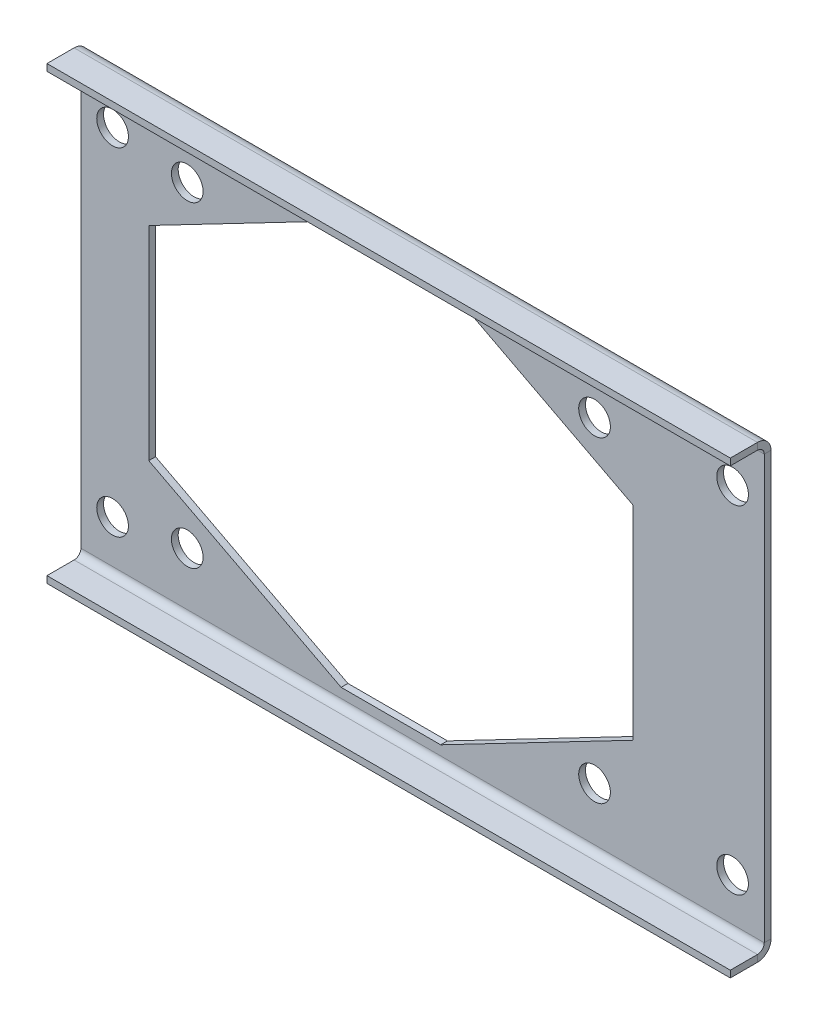
ISO-10303-21;
HEADER;
FILE_DESCRIPTION(('STEP AP214'),'2;1');
FILE_NAME('part.step','',(''),(''),'','','');
FILE_SCHEMA(('AUTOMOTIVE_DESIGN { 1 0 10303 214 1 1 1 1 }'));
ENDSEC;
DATA;
#1=APPLICATION_CONTEXT('core data for automotive mechanical design processes');
#2=APPLICATION_PROTOCOL_DEFINITION('international standard','automotive_design',2000,#1);
#3=PRODUCT_CONTEXT('',#1,'mechanical');
#4=PRODUCT('Part','Part','',(#3));
#5=PRODUCT_RELATED_PRODUCT_CATEGORY('part','',(#4));
#6=PRODUCT_DEFINITION_FORMATION('','',#4);
#7=PRODUCT_DEFINITION_CONTEXT('part definition',#1,'design');
#8=PRODUCT_DEFINITION('design','',#6,#7);
#9=PRODUCT_DEFINITION_SHAPE('','',#8);
#10=(LENGTH_UNIT() NAMED_UNIT(*) SI_UNIT(.MILLI.,.METRE.));
#11=(NAMED_UNIT(*) PLANE_ANGLE_UNIT() SI_UNIT($,.RADIAN.));
#12=(NAMED_UNIT(*) SI_UNIT($,.STERADIAN.) SOLID_ANGLE_UNIT());
#13=UNCERTAINTY_MEASURE_WITH_UNIT(LENGTH_MEASURE(1.E-05),#10,'distance_accuracy_value','');
#14=(GEOMETRIC_REPRESENTATION_CONTEXT(3) GLOBAL_UNCERTAINTY_ASSIGNED_CONTEXT((#13)) GLOBAL_UNIT_ASSIGNED_CONTEXT((#10,
#11,#12)) REPRESENTATION_CONTEXT('',''));
#15=CARTESIAN_POINT('',(0.,0.,0.));
#16=DIRECTION('',(0.,0.,1.));
#17=DIRECTION('',(1.,0.,0.));
#18=AXIS2_PLACEMENT_3D('',#15,#16,#17);
#19=CARTESIAN_POINT('',(151.,96.5,-3.));
#20=DIRECTION('',(1.,0.,0.));
#21=DIRECTION('',(0.,0.,-1.));
#22=AXIS2_PLACEMENT_3D('',#19,#20,#21);
#23=PLANE('',#22);
#24=DIRECTION('',(0.,1.,0.));
#25=VECTOR('',#24,1.);
#26=CARTESIAN_POINT('',(151.,96.5,0.));
#27=LINE('',#26,#25);
#28=CARTESIAN_POINT('',(151.,2.99999999999999,0.));
#29=VERTEX_POINT('',#28);
#30=CARTESIAN_POINT('',(151.,190.,0.));
#31=VERTEX_POINT('',#30);
#32=EDGE_CURVE('E345',#29,#31,#27,.T.);
#33=ORIENTED_EDGE('',*,*,#32,.F.);
#34=DIRECTION('',(0.,0.,-1.));
#35=VECTOR('',#34,1.);
#36=CARTESIAN_POINT('',(151.,2.99999999999999,0.));
#37=LINE('',#36,#35);
#38=CARTESIAN_POINT('',(151.,2.99999999999999,-3.));
#39=VERTEX_POINT('',#38);
#40=EDGE_CURVE('E310',#29,#39,#37,.T.);
#41=ORIENTED_EDGE('',*,*,#40,.T.);
#42=DIRECTION('',(0.,1.,0.));
#43=VECTOR('',#42,1.);
#44=CARTESIAN_POINT('',(151.,96.5,-3.));
#45=LINE('',#44,#43);
#46=CARTESIAN_POINT('',(151.,190.,-3.));
#47=VERTEX_POINT('',#46);
#48=EDGE_CURVE('E328',#39,#47,#45,.T.);
#49=ORIENTED_EDGE('',*,*,#48,.T.);
#50=DIRECTION('',(0.,0.,-1.));
#51=VECTOR('',#50,1.);
#52=CARTESIAN_POINT('',(151.,190.,0.));
#53=LINE('',#52,#51);
#54=EDGE_CURVE('E227',#31,#47,#53,.T.);
#55=ORIENTED_EDGE('',*,*,#54,.F.);
#56=EDGE_LOOP('',(#33,#41,#49,#55));
#57=FACE_BOUND('',#56,.T.);
#58=ADVANCED_FACE('F45',(#57),#23,.T.);
#59=CARTESIAN_POINT('',(0.,0.,-3.));
#60=DIRECTION('',(0.,0.,-1.));
#61=DIRECTION('',(-1.,0.,0.));
#62=AXIS2_PLACEMENT_3D('',#59,#60,#61);
#63=PLANE('',#62);
#64=CARTESIAN_POINT('',(76.,26.5,-3.));
#65=DIRECTION('',(0.,0.,1.));
#66=DIRECTION('',(1.,0.,0.));
#67=AXIS2_PLACEMENT_3D('',#64,#65,#66);
#68=CIRCLE('',#67,7.);
#69=CARTESIAN_POINT('',(83.,26.5,-3.));
#70=VERTEX_POINT('',#69);
#71=EDGE_CURVE('E818',#70,#70,#68,.T.);
#72=ORIENTED_EDGE('',*,*,#71,.T.);
#73=EDGE_LOOP('',(#72));
#74=FACE_BOUND('',#73,.T.);
#75=CARTESIAN_POINT('',(-104.,26.5,-3.));
#76=DIRECTION('',(0.,0.,1.));
#77=DIRECTION('',(1.,0.,0.));
#78=AXIS2_PLACEMENT_3D('',#75,#76,#77);
#79=CIRCLE('',#78,7.);
#80=CARTESIAN_POINT('',(-97.,26.5,-3.));
#81=VERTEX_POINT('',#80);
#82=EDGE_CURVE('E924',#81,#81,#79,.T.);
#83=ORIENTED_EDGE('',*,*,#82,.T.);
#84=EDGE_LOOP('',(#83));
#85=FACE_BOUND('',#84,.T.);
#86=CARTESIAN_POINT('',(-104.,166.5,-3.));
#87=DIRECTION('',(0.,0.,1.));
#88=DIRECTION('',(1.,0.,0.));
#89=AXIS2_PLACEMENT_3D('',#86,#87,#88);
#90=CIRCLE('',#89,7.);
#91=CARTESIAN_POINT('',(-97.,166.5,-3.));
#92=VERTEX_POINT('',#91);
#93=EDGE_CURVE('E834',#92,#92,#90,.T.);
#94=ORIENTED_EDGE('',*,*,#93,.T.);
#95=EDGE_LOOP('',(#94));
#96=FACE_BOUND('',#95,.T.);
#97=CARTESIAN_POINT('',(76.,166.5,-3.));
#98=DIRECTION('',(0.,0.,1.));
#99=DIRECTION('',(1.,0.,0.));
#100=AXIS2_PLACEMENT_3D('',#97,#98,#99);
#101=CIRCLE('',#100,7.);
#102=CARTESIAN_POINT('',(83.,166.5,-3.));
#103=VERTEX_POINT('',#102);
#104=EDGE_CURVE('E827',#103,#103,#101,.T.);
#105=ORIENTED_EDGE('',*,*,#104,.T.);
#106=EDGE_LOOP('',(#105));
#107=FACE_BOUND('',#106,.T.);
#108=CARTESIAN_POINT('',(137.,171.,-3.));
#109=DIRECTION('',(0.,0.,-1.));
#110=DIRECTION('',(1.,0.,0.));
#111=AXIS2_PLACEMENT_3D('',#108,#109,#110);
#112=CIRCLE('',#111,7.00000000000002);
#113=CARTESIAN_POINT('',(144.,171.,-3.));
#114=VERTEX_POINT('',#113);
#115=EDGE_CURVE('E830',#114,#114,#112,.T.);
#116=ORIENTED_EDGE('',*,*,#115,.F.);
#117=EDGE_LOOP('',(#116));
#118=FACE_BOUND('',#117,.T.);
#119=CARTESIAN_POINT('',(137.,22.,-3.));
#120=DIRECTION('',(0.,0.,-1.));
#121=DIRECTION('',(1.,0.,0.));
#122=AXIS2_PLACEMENT_3D('',#119,#120,#121);
#123=CIRCLE('',#122,7.00000000000001);
#124=CARTESIAN_POINT('',(144.,22.,-3.));
#125=VERTEX_POINT('',#124);
#126=EDGE_CURVE('E845',#125,#125,#123,.T.);
#127=ORIENTED_EDGE('',*,*,#126,.F.);
#128=EDGE_LOOP('',(#127));
#129=FACE_BOUND('',#128,.T.);
#130=CARTESIAN_POINT('',(-137.,22.,-3.));
#131=DIRECTION('',(0.,0.,-1.));
#132=DIRECTION('',(-1.,0.,0.));
#133=AXIS2_PLACEMENT_3D('',#130,#131,#132);
#134=CIRCLE('',#133,7.00000000000001);
#135=CARTESIAN_POINT('',(-144.,22.,-3.));
#136=VERTEX_POINT('',#135);
#137=EDGE_CURVE('E839',#136,#136,#134,.T.);
#138=ORIENTED_EDGE('',*,*,#137,.F.);
#139=EDGE_LOOP('',(#138));
#140=FACE_BOUND('',#139,.T.);
#141=CARTESIAN_POINT('',(-137.,171.,-3.));
#142=DIRECTION('',(0.,0.,-1.));
#143=DIRECTION('',(-1.,0.,0.));
#144=AXIS2_PLACEMENT_3D('',#141,#142,#143);
#145=CIRCLE('',#144,7.00000000000002);
#146=CARTESIAN_POINT('',(-144.,171.,-3.));
#147=VERTEX_POINT('',#146);
#148=EDGE_CURVE('E838',#147,#147,#145,.T.);
#149=ORIENTED_EDGE('',*,*,#148,.F.);
#150=EDGE_LOOP('',(#149));
#151=FACE_BOUND('',#150,.T.);
#152=DIRECTION('',(0.,-1.,0.));
#153=VECTOR('',#152,1.);
#154=CARTESIAN_POINT('',(-151.,0.,-3.));
#155=LINE('',#154,#153);
#156=CARTESIAN_POINT('',(-151.,190.,-3.));
#157=VERTEX_POINT('',#156);
#158=CARTESIAN_POINT('',(-151.,3.00000000000001,-3.));
#159=VERTEX_POINT('',#158);
#160=EDGE_CURVE('E325',#157,#159,#155,.T.);
#161=ORIENTED_EDGE('',*,*,#160,.F.);
#162=DIRECTION('',(1.,0.,0.));
#163=VECTOR('',#162,1.);
#164=CARTESIAN_POINT('',(151.,190.,-3.));
#165=LINE('',#164,#163);
#166=EDGE_CURVE('E228',#47,#157,#165,.F.);
#167=ORIENTED_EDGE('',*,*,#166,.F.);
#168=ORIENTED_EDGE('',*,*,#48,.F.);
#169=DIRECTION('',(1.,0.,0.));
#170=VECTOR('',#169,1.);
#171=CARTESIAN_POINT('',(151.,2.99999999999999,-3.));
#172=LINE('',#171,#170);
#173=EDGE_CURVE('E305',#39,#159,#172,.F.);
#174=ORIENTED_EDGE('',*,*,#173,.T.);
#175=EDGE_LOOP('',(#161,#167,#168,#174));
#176=FACE_BOUND('',#175,.T.);
#177=DIRECTION('',(-0.887003136739446,-0.461763397655535,0.));
#178=VECTOR('',#177,1.);
#179=CARTESIAN_POINT('',(-121.,141.5,-3.));
#180=LINE('',#179,#178);
#181=CARTESIAN_POINT('',(-36.,185.75,-3.));
#182=VERTEX_POINT('',#181);
#183=CARTESIAN_POINT('',(-121.,141.5,-3.));
#184=VERTEX_POINT('',#183);
#185=EDGE_CURVE('E254',#182,#184,#180,.T.);
#186=ORIENTED_EDGE('',*,*,#185,.T.);
#187=DIRECTION('',(0.,1.,0.));
#188=VECTOR('',#187,1.);
#189=CARTESIAN_POINT('',(-121.,96.5,-3.));
#190=LINE('',#189,#188);
#191=CARTESIAN_POINT('',(-121.,51.5,-3.));
#192=VERTEX_POINT('',#191);
#193=EDGE_CURVE('E341',#192,#184,#190,.T.);
#194=ORIENTED_EDGE('',*,*,#193,.F.);
#195=DIRECTION('',(-0.887003136739446,0.461763397655535,0.));
#196=VECTOR('',#195,1.);
#197=CARTESIAN_POINT('',(-121.,51.5,-3.));
#198=LINE('',#197,#196);
#199=CARTESIAN_POINT('',(-36.,7.25000000000001,-3.));
#200=VERTEX_POINT('',#199);
#201=EDGE_CURVE('E339',#200,#192,#198,.T.);
#202=ORIENTED_EDGE('',*,*,#201,.F.);
#203=DIRECTION('',(-1.,0.,0.));
#204=VECTOR('',#203,1.);
#205=CARTESIAN_POINT('',(-36.,7.25000000000001,-3.));
#206=LINE('',#205,#204);
#207=CARTESIAN_POINT('',(7.99999999999999,7.25000000000001,-3.));
#208=VERTEX_POINT('',#207);
#209=EDGE_CURVE('E336',#208,#200,#206,.T.);
#210=ORIENTED_EDGE('',*,*,#209,.F.);
#211=DIRECTION('',(-0.887003136739446,-0.461763397655535,0.));
#212=VECTOR('',#211,1.);
#213=CARTESIAN_POINT('',(7.99999999999999,7.25000000000001,-3.));
#214=LINE('',#213,#212);
#215=CARTESIAN_POINT('',(93.,51.5,-3.));
#216=VERTEX_POINT('',#215);
#217=EDGE_CURVE('E334',#216,#208,#214,.T.);
#218=ORIENTED_EDGE('',*,*,#217,.F.);
#219=DIRECTION('',(0.,-1.,0.));
#220=VECTOR('',#219,1.);
#221=CARTESIAN_POINT('',(93.,51.5,-3.));
#222=LINE('',#221,#220);
#223=CARTESIAN_POINT('',(93.,141.5,-3.));
#224=VERTEX_POINT('',#223);
#225=EDGE_CURVE('E331',#224,#216,#222,.T.);
#226=ORIENTED_EDGE('',*,*,#225,.F.);
#227=DIRECTION('',(-0.887003136739446,0.461763397655535,0.));
#228=VECTOR('',#227,1.);
#229=CARTESIAN_POINT('',(7.99999999999999,185.75,-3.));
#230=LINE('',#229,#228);
#231=CARTESIAN_POINT('',(7.99999999999999,185.75,-3.));
#232=VERTEX_POINT('',#231);
#233=EDGE_CURVE('E247',#224,#232,#230,.T.);
#234=ORIENTED_EDGE('',*,*,#233,.T.);
#235=DIRECTION('',(-1.,0.,0.));
#236=VECTOR('',#235,1.);
#237=CARTESIAN_POINT('',(-36.,185.75,-3.));
#238=LINE('',#237,#236);
#239=EDGE_CURVE('E250',#232,#182,#238,.T.);
#240=ORIENTED_EDGE('',*,*,#239,.T.);
#241=EDGE_LOOP('',(#186,#194,#202,#210,#218,#226,#234,#240));
#242=FACE_BOUND('',#241,.T.);
#243=ADVANCED_FACE('F376',(#74,#85,#96,#107,#118,#129,#140,#151,#176,#242),#63,.T.);
#244=CARTESIAN_POINT('',(0.,0.,0.));
#245=DIRECTION('',(0.,0.,-1.));
#246=DIRECTION('',(-1.,0.,0.));
#247=AXIS2_PLACEMENT_3D('',#244,#245,#246);
#248=PLANE('',#247);
#249=CARTESIAN_POINT('',(76.,26.5,0.));
#250=DIRECTION('',(0.,0.,1.));
#251=DIRECTION('',(1.,0.,0.));
#252=AXIS2_PLACEMENT_3D('',#249,#250,#251);
#253=CIRCLE('',#252,7.);
#254=CARTESIAN_POINT('',(83.,26.5,0.));
#255=VERTEX_POINT('',#254);
#256=EDGE_CURVE('E821',#255,#255,#253,.T.);
#257=ORIENTED_EDGE('',*,*,#256,.F.);
#258=EDGE_LOOP('',(#257));
#259=FACE_BOUND('',#258,.T.);
#260=CARTESIAN_POINT('',(-104.,26.5,0.));
#261=DIRECTION('',(0.,0.,1.));
#262=DIRECTION('',(1.,0.,0.));
#263=AXIS2_PLACEMENT_3D('',#260,#261,#262);
#264=CIRCLE('',#263,7.);
#265=CARTESIAN_POINT('',(-97.,26.5,0.));
#266=VERTEX_POINT('',#265);
#267=EDGE_CURVE('E823',#266,#266,#264,.T.);
#268=ORIENTED_EDGE('',*,*,#267,.F.);
#269=EDGE_LOOP('',(#268));
#270=FACE_BOUND('',#269,.T.);
#271=CARTESIAN_POINT('',(-104.,166.5,0.));
#272=DIRECTION('',(0.,0.,1.));
#273=DIRECTION('',(1.,0.,0.));
#274=AXIS2_PLACEMENT_3D('',#271,#272,#273);
#275=CIRCLE('',#274,7.);
#276=CARTESIAN_POINT('',(-97.,166.5,0.));
#277=VERTEX_POINT('',#276);
#278=EDGE_CURVE('E919',#277,#277,#275,.T.);
#279=ORIENTED_EDGE('',*,*,#278,.F.);
#280=EDGE_LOOP('',(#279));
#281=FACE_BOUND('',#280,.T.);
#282=CARTESIAN_POINT('',(76.,166.5,0.));
#283=DIRECTION('',(0.,0.,1.));
#284=DIRECTION('',(1.,0.,0.));
#285=AXIS2_PLACEMENT_3D('',#282,#283,#284);
#286=CIRCLE('',#285,7.);
#287=CARTESIAN_POINT('',(83.,166.5,0.));
#288=VERTEX_POINT('',#287);
#289=EDGE_CURVE('E831',#288,#288,#286,.T.);
#290=ORIENTED_EDGE('',*,*,#289,.F.);
#291=EDGE_LOOP('',(#290));
#292=FACE_BOUND('',#291,.T.);
#293=CARTESIAN_POINT('',(137.,171.,0.));
#294=DIRECTION('',(0.,0.,-1.));
#295=DIRECTION('',(1.,0.,0.));
#296=AXIS2_PLACEMENT_3D('',#293,#294,#295);
#297=CIRCLE('',#296,7.00000000000002);
#298=CARTESIAN_POINT('',(144.,171.,0.));
#299=VERTEX_POINT('',#298);
#300=EDGE_CURVE('E848',#299,#299,#297,.T.);
#301=ORIENTED_EDGE('',*,*,#300,.T.);
#302=EDGE_LOOP('',(#301));
#303=FACE_BOUND('',#302,.T.);
#304=CARTESIAN_POINT('',(137.,22.,0.));
#305=DIRECTION('',(0.,0.,-1.));
#306=DIRECTION('',(1.,0.,0.));
#307=AXIS2_PLACEMENT_3D('',#304,#305,#306);
#308=CIRCLE('',#307,7.00000000000001);
#309=CARTESIAN_POINT('',(144.,22.,0.));
#310=VERTEX_POINT('',#309);
#311=EDGE_CURVE('E842',#310,#310,#308,.T.);
#312=ORIENTED_EDGE('',*,*,#311,.T.);
#313=EDGE_LOOP('',(#312));
#314=FACE_BOUND('',#313,.T.);
#315=CARTESIAN_POINT('',(-137.,22.,0.));
#316=DIRECTION('',(0.,0.,-1.));
#317=DIRECTION('',(-1.,0.,0.));
#318=AXIS2_PLACEMENT_3D('',#315,#316,#317);
#319=CIRCLE('',#318,7.00000000000001);
#320=CARTESIAN_POINT('',(-144.,22.,0.));
#321=VERTEX_POINT('',#320);
#322=EDGE_CURVE('E835',#321,#321,#319,.T.);
#323=ORIENTED_EDGE('',*,*,#322,.T.);
#324=EDGE_LOOP('',(#323));
#325=FACE_BOUND('',#324,.T.);
#326=CARTESIAN_POINT('',(-137.,171.,0.));
#327=DIRECTION('',(0.,0.,-1.));
#328=DIRECTION('',(-1.,0.,0.));
#329=AXIS2_PLACEMENT_3D('',#326,#327,#328);
#330=CIRCLE('',#329,7.00000000000002);
#331=CARTESIAN_POINT('',(-144.,171.,0.));
#332=VERTEX_POINT('',#331);
#333=EDGE_CURVE('E853',#332,#332,#330,.T.);
#334=ORIENTED_EDGE('',*,*,#333,.T.);
#335=EDGE_LOOP('',(#334));
#336=FACE_BOUND('',#335,.T.);
#337=DIRECTION('',(1.,0.,0.));
#338=VECTOR('',#337,1.);
#339=CARTESIAN_POINT('',(151.,190.,0.));
#340=LINE('',#339,#338);
#341=CARTESIAN_POINT('',(-151.,190.,0.));
#342=VERTEX_POINT('',#341);
#343=EDGE_CURVE('E233',#31,#342,#340,.F.);
#344=ORIENTED_EDGE('',*,*,#343,.T.);
#345=DIRECTION('',(0.,-1.,0.));
#346=VECTOR('',#345,1.);
#347=CARTESIAN_POINT('',(-151.,0.,0.));
#348=LINE('',#347,#346);
#349=CARTESIAN_POINT('',(-151.,2.99999999999999,0.));
#350=VERTEX_POINT('',#349);
#351=EDGE_CURVE('E322',#342,#350,#348,.T.);
#352=ORIENTED_EDGE('',*,*,#351,.T.);
#353=DIRECTION('',(1.,0.,0.));
#354=VECTOR('',#353,1.);
#355=CARTESIAN_POINT('',(151.,2.99999999999999,0.));
#356=LINE('',#355,#354);
#357=EDGE_CURVE('E316',#29,#350,#356,.F.);
#358=ORIENTED_EDGE('',*,*,#357,.F.);
#359=ORIENTED_EDGE('',*,*,#32,.T.);
#360=EDGE_LOOP('',(#344,#352,#358,#359));
#361=FACE_BOUND('',#360,.T.);
#362=DIRECTION('',(0.,1.,0.));
#363=VECTOR('',#362,1.);
#364=CARTESIAN_POINT('',(-121.,96.5,0.));
#365=LINE('',#364,#363);
#366=CARTESIAN_POINT('',(-121.,51.5,0.));
#367=VERTEX_POINT('',#366);
#368=CARTESIAN_POINT('',(-121.,141.5,0.));
#369=VERTEX_POINT('',#368);
#370=EDGE_CURVE('E329',#367,#369,#365,.T.);
#371=ORIENTED_EDGE('',*,*,#370,.T.);
#372=DIRECTION('',(-0.887003136739446,-0.461763397655535,0.));
#373=VECTOR('',#372,1.);
#374=CARTESIAN_POINT('',(-121.,141.5,0.));
#375=LINE('',#374,#373);
#376=CARTESIAN_POINT('',(-36.,185.75,0.));
#377=VERTEX_POINT('',#376);
#378=EDGE_CURVE('E251',#377,#369,#375,.T.);
#379=ORIENTED_EDGE('',*,*,#378,.F.);
#380=DIRECTION('',(-1.,0.,0.));
#381=VECTOR('',#380,1.);
#382=CARTESIAN_POINT('',(-36.,185.75,0.));
#383=LINE('',#382,#381);
#384=CARTESIAN_POINT('',(7.99999999999999,185.75,0.));
#385=VERTEX_POINT('',#384);
#386=EDGE_CURVE('E260',#385,#377,#383,.T.);
#387=ORIENTED_EDGE('',*,*,#386,.F.);
#388=DIRECTION('',(-0.887003136739446,0.461763397655535,0.));
#389=VECTOR('',#388,1.);
#390=CARTESIAN_POINT('',(7.99999999999999,185.75,0.));
#391=LINE('',#390,#389);
#392=CARTESIAN_POINT('',(93.,141.5,0.));
#393=VERTEX_POINT('',#392);
#394=EDGE_CURVE('E245',#393,#385,#391,.T.);
#395=ORIENTED_EDGE('',*,*,#394,.F.);
#396=DIRECTION('',(0.,-1.,0.));
#397=VECTOR('',#396,1.);
#398=CARTESIAN_POINT('',(93.,51.5,0.));
#399=LINE('',#398,#397);
#400=CARTESIAN_POINT('',(93.,51.5,0.));
#401=VERTEX_POINT('',#400);
#402=EDGE_CURVE('E347',#393,#401,#399,.T.);
#403=ORIENTED_EDGE('',*,*,#402,.T.);
#404=DIRECTION('',(-0.887003136739446,-0.461763397655535,0.));
#405=VECTOR('',#404,1.);
#406=CARTESIAN_POINT('',(7.99999999999999,7.25000000000001,0.));
#407=LINE('',#406,#405);
#408=CARTESIAN_POINT('',(7.99999999999999,7.25000000000001,0.));
#409=VERTEX_POINT('',#408);
#410=EDGE_CURVE('E350',#401,#409,#407,.T.);
#411=ORIENTED_EDGE('',*,*,#410,.T.);
#412=DIRECTION('',(-1.,0.,0.));
#413=VECTOR('',#412,1.);
#414=CARTESIAN_POINT('',(-36.,7.25000000000001,0.));
#415=LINE('',#414,#413);
#416=CARTESIAN_POINT('',(-36.,7.25000000000001,0.));
#417=VERTEX_POINT('',#416);
#418=EDGE_CURVE('E353',#409,#417,#415,.T.);
#419=ORIENTED_EDGE('',*,*,#418,.T.);
#420=DIRECTION('',(-0.887003136739446,0.461763397655535,0.));
#421=VECTOR('',#420,1.);
#422=CARTESIAN_POINT('',(-121.,51.5,0.));
#423=LINE('',#422,#421);
#424=EDGE_CURVE('E356',#417,#367,#423,.T.);
#425=ORIENTED_EDGE('',*,*,#424,.T.);
#426=EDGE_LOOP('',(#371,#379,#387,#395,#403,#411,#419,#425));
#427=FACE_BOUND('',#426,.T.);
#428=ADVANCED_FACE('F368',(#259,#270,#281,#292,#303,#314,#325,#336,#361,#427),#248,.F.);
#429=CARTESIAN_POINT('',(-151.,0.,-3.));
#430=DIRECTION('',(-1.,0.,0.));
#431=DIRECTION('',(0.,0.,1.));
#432=AXIS2_PLACEMENT_3D('',#429,#430,#431);
#433=PLANE('',#432);
#434=DIRECTION('',(0.,0.,-1.));
#435=VECTOR('',#434,1.);
#436=CARTESIAN_POINT('',(-151.,2.99999999999999,0.));
#437=LINE('',#436,#435);
#438=EDGE_CURVE('E320',#350,#159,#437,.T.);
#439=ORIENTED_EDGE('',*,*,#438,.F.);
#440=ORIENTED_EDGE('',*,*,#351,.F.);
#441=DIRECTION('',(0.,0.,-1.));
#442=VECTOR('',#441,1.);
#443=CARTESIAN_POINT('',(-151.,190.,0.));
#444=LINE('',#443,#442);
#445=EDGE_CURVE('E242',#342,#157,#444,.T.);
#446=ORIENTED_EDGE('',*,*,#445,.T.);
#447=ORIENTED_EDGE('',*,*,#160,.T.);
#448=EDGE_LOOP('',(#439,#440,#446,#447));
#449=FACE_BOUND('',#448,.T.);
#450=ADVANCED_FACE('F47',(#449),#433,.T.);
#451=CARTESIAN_POINT('',(-121.,96.5,-3.));
#452=DIRECTION('',(1.,0.,0.));
#453=DIRECTION('',(0.,0.,-1.));
#454=AXIS2_PLACEMENT_3D('',#451,#452,#453);
#455=PLANE('',#454);
#456=ORIENTED_EDGE('',*,*,#370,.F.);
#457=DIRECTION('',(0.,0.,1.));
#458=VECTOR('',#457,1.);
#459=CARTESIAN_POINT('',(-121.,51.5,-3.));
#460=LINE('',#459,#458);
#461=EDGE_CURVE('E11',#192,#367,#460,.T.);
#462=ORIENTED_EDGE('',*,*,#461,.F.);
#463=ORIENTED_EDGE('',*,*,#193,.T.);
#464=DIRECTION('',(0.,0.,1.));
#465=VECTOR('',#464,1.);
#466=CARTESIAN_POINT('',(-121.,141.5,-3.));
#467=LINE('',#466,#465);
#468=EDGE_CURVE('E265',#184,#369,#467,.T.);
#469=ORIENTED_EDGE('',*,*,#468,.T.);
#470=EDGE_LOOP('',(#456,#462,#463,#469));
#471=FACE_BOUND('',#470,.T.);
#472=ADVANCED_FACE('F383',(#471),#455,.T.);
#473=CARTESIAN_POINT('',(-121.,51.5,-3.));
#474=DIRECTION('',(0.461763397655535,0.887003136739446,0.));
#475=DIRECTION('',(-0.887003136739446,0.461763397655535,0.));
#476=AXIS2_PLACEMENT_3D('',#473,#474,#475);
#477=PLANE('',#476);
#478=ORIENTED_EDGE('',*,*,#424,.F.);
#479=DIRECTION('',(0.,0.,1.));
#480=VECTOR('',#479,1.);
#481=CARTESIAN_POINT('',(-36.,7.25000000000001,-3.));
#482=LINE('',#481,#480);
#483=EDGE_CURVE('E54',#200,#417,#482,.T.);
#484=ORIENTED_EDGE('',*,*,#483,.F.);
#485=ORIENTED_EDGE('',*,*,#201,.T.);
#486=ORIENTED_EDGE('',*,*,#461,.T.);
#487=EDGE_LOOP('',(#478,#484,#485,#486));
#488=FACE_BOUND('',#487,.T.);
#489=ADVANCED_FACE('F381',(#488),#477,.T.);
#490=CARTESIAN_POINT('',(-36.,7.25000000000001,-3.));
#491=DIRECTION('',(0.,1.,0.));
#492=DIRECTION('',(0.,0.,1.));
#493=AXIS2_PLACEMENT_3D('',#490,#491,#492);
#494=PLANE('',#493);
#495=ORIENTED_EDGE('',*,*,#418,.F.);
#496=DIRECTION('',(0.,0.,1.));
#497=VECTOR('',#496,1.);
#498=CARTESIAN_POINT('',(7.99999999999999,7.25000000000001,-3.));
#499=LINE('',#498,#497);
#500=EDGE_CURVE('E360',#208,#409,#499,.T.);
#501=ORIENTED_EDGE('',*,*,#500,.F.);
#502=ORIENTED_EDGE('',*,*,#209,.T.);
#503=ORIENTED_EDGE('',*,*,#483,.T.);
#504=EDGE_LOOP('',(#495,#501,#502,#503));
#505=FACE_BOUND('',#504,.T.);
#506=ADVANCED_FACE('F380',(#505),#494,.T.);
#507=CARTESIAN_POINT('',(7.99999999999999,7.25000000000001,-3.));
#508=DIRECTION('',(-0.461763397655535,0.887003136739446,0.));
#509=DIRECTION('',(-0.887003136739446,-0.461763397655535,0.));
#510=AXIS2_PLACEMENT_3D('',#507,#508,#509);
#511=PLANE('',#510);
#512=ORIENTED_EDGE('',*,*,#410,.F.);
#513=DIRECTION('',(0.,0.,1.));
#514=VECTOR('',#513,1.);
#515=CARTESIAN_POINT('',(93.,51.5,-3.));
#516=LINE('',#515,#514);
#517=EDGE_CURVE('E49',#216,#401,#516,.T.);
#518=ORIENTED_EDGE('',*,*,#517,.F.);
#519=ORIENTED_EDGE('',*,*,#217,.T.);
#520=ORIENTED_EDGE('',*,*,#500,.T.);
#521=EDGE_LOOP('',(#512,#518,#519,#520));
#522=FACE_BOUND('',#521,.T.);
#523=ADVANCED_FACE('F365',(#522),#511,.T.);
#524=CARTESIAN_POINT('',(93.,51.5,-3.));
#525=DIRECTION('',(-1.,0.,0.));
#526=DIRECTION('',(0.,0.,1.));
#527=AXIS2_PLACEMENT_3D('',#524,#525,#526);
#528=PLANE('',#527);
#529=ORIENTED_EDGE('',*,*,#402,.F.);
#530=DIRECTION('',(0.,0.,1.));
#531=VECTOR('',#530,1.);
#532=CARTESIAN_POINT('',(93.,141.5,-3.));
#533=LINE('',#532,#531);
#534=EDGE_CURVE('E257',#224,#393,#533,.T.);
#535=ORIENTED_EDGE('',*,*,#534,.F.);
#536=ORIENTED_EDGE('',*,*,#225,.T.);
#537=ORIENTED_EDGE('',*,*,#517,.T.);
#538=EDGE_LOOP('',(#529,#535,#536,#537));
#539=FACE_BOUND('',#538,.T.);
#540=ADVANCED_FACE('F363',(#539),#528,.T.);
#541=CARTESIAN_POINT('',(-151.,2.99999999999999,3.));
#542=DIRECTION('',(-1.,0.,0.));
#543=DIRECTION('',(0.,0.,1.));
#544=AXIS2_PLACEMENT_3D('',#541,#542,#543);
#545=PLANE('',#544);
#546=DIRECTION('',(0.,-1.,0.));
#547=VECTOR('',#546,1.);
#548=CARTESIAN_POINT('',(-151.,0.,2.99999999999999));
#549=LINE('',#548,#547);
#550=CARTESIAN_POINT('',(-151.,0.,2.99999999999999));
#551=VERTEX_POINT('',#550);
#552=CARTESIAN_POINT('',(-151.,-3.00000000000001,2.99999999999998));
#553=VERTEX_POINT('',#552);
#554=EDGE_CURVE('E268',#551,#553,#549,.T.);
#555=ORIENTED_EDGE('',*,*,#554,.F.);
#556=CARTESIAN_POINT('',(-151.,2.99999999999999,3.));
#557=DIRECTION('',(1.,0.,0.));
#558=DIRECTION('',(0.,0.,-1.));
#559=AXIS2_PLACEMENT_3D('',#556,#557,#558);
#560=CIRCLE('',#559,3.);
#561=EDGE_CURVE('E313',#350,#551,#560,.F.);
#562=ORIENTED_EDGE('',*,*,#561,.F.);
#563=ORIENTED_EDGE('',*,*,#438,.T.);
#564=CARTESIAN_POINT('',(-151.,2.99999999999999,3.));
#565=DIRECTION('',(1.,0.,0.));
#566=DIRECTION('',(0.,0.,-1.));
#567=AXIS2_PLACEMENT_3D('',#564,#565,#566);
#568=CIRCLE('',#567,6.);
#569=EDGE_CURVE('E62',#159,#553,#568,.F.);
#570=ORIENTED_EDGE('',*,*,#569,.T.);
#571=EDGE_LOOP('',(#555,#562,#563,#570));
#572=FACE_BOUND('',#571,.T.);
#573=ADVANCED_FACE('F406',(#572),#545,.T.);
#574=CARTESIAN_POINT('',(151.,2.99999999999999,3.));
#575=DIRECTION('',(-1.,0.,0.));
#576=DIRECTION('',(0.,0.,1.));
#577=AXIS2_PLACEMENT_3D('',#574,#575,#576);
#578=PLANE('',#577);
#579=CARTESIAN_POINT('',(151.,2.99999999999999,3.));
#580=DIRECTION('',(1.,0.,0.));
#581=DIRECTION('',(0.,0.,-1.));
#582=AXIS2_PLACEMENT_3D('',#579,#580,#581);
#583=CIRCLE('',#582,3.);
#584=CARTESIAN_POINT('',(151.,0.,2.99999999999999));
#585=VERTEX_POINT('',#584);
#586=EDGE_CURVE('E304',#585,#29,#583,.T.);
#587=ORIENTED_EDGE('',*,*,#586,.F.);
#588=DIRECTION('',(0.,-1.,0.));
#589=VECTOR('',#588,1.);
#590=CARTESIAN_POINT('',(151.,0.,2.99999999999999));
#591=LINE('',#590,#589);
#592=CARTESIAN_POINT('',(151.,-3.00000000000001,2.99999999999998));
#593=VERTEX_POINT('',#592);
#594=EDGE_CURVE('E277',#585,#593,#591,.T.);
#595=ORIENTED_EDGE('',*,*,#594,.T.);
#596=CARTESIAN_POINT('',(151.,2.99999999999999,3.));
#597=DIRECTION('',(1.,0.,0.));
#598=DIRECTION('',(0.,0.,-1.));
#599=AXIS2_PLACEMENT_3D('',#596,#597,#598);
#600=CIRCLE('',#599,6.);
#601=EDGE_CURVE('E308',#593,#39,#600,.T.);
#602=ORIENTED_EDGE('',*,*,#601,.T.);
#603=ORIENTED_EDGE('',*,*,#40,.F.);
#604=EDGE_LOOP('',(#587,#595,#602,#603));
#605=FACE_BOUND('',#604,.T.);
#606=ADVANCED_FACE('F460',(#605),#578,.F.);
#607=CARTESIAN_POINT('',(151.,2.99999999999999,3.));
#608=DIRECTION('',(1.,0.,0.));
#609=DIRECTION('',(0.,-1.,0.));
#610=AXIS2_PLACEMENT_3D('',#607,#608,#609);
#611=CYLINDRICAL_SURFACE('',#610,6.);
#612=ORIENTED_EDGE('',*,*,#173,.F.);
#613=ORIENTED_EDGE('',*,*,#601,.F.);
#614=DIRECTION('',(-1.,0.,0.));
#615=VECTOR('',#614,1.);
#616=CARTESIAN_POINT('',(0.,-3.00000000000001,2.99999999999998));
#617=LINE('',#616,#615);
#618=EDGE_CURVE('E280',#593,#553,#617,.T.);
#619=ORIENTED_EDGE('',*,*,#618,.T.);
#620=ORIENTED_EDGE('',*,*,#569,.F.);
#621=EDGE_LOOP('',(#612,#613,#619,#620));
#622=FACE_BOUND('',#621,.T.);
#623=ADVANCED_FACE('F471',(#622),#611,.T.);
#624=CARTESIAN_POINT('',(151.,2.99999999999999,3.));
#625=DIRECTION('',(1.,0.,0.));
#626=DIRECTION('',(0.,-1.,0.));
#627=AXIS2_PLACEMENT_3D('',#624,#625,#626);
#628=CYLINDRICAL_SURFACE('',#627,3.);
#629=ORIENTED_EDGE('',*,*,#357,.T.);
#630=ORIENTED_EDGE('',*,*,#561,.T.);
#631=DIRECTION('',(1.,0.,0.));
#632=VECTOR('',#631,1.);
#633=CARTESIAN_POINT('',(-151.,0.,2.99999999999999));
#634=LINE('',#633,#632);
#635=EDGE_CURVE('E275',#551,#585,#634,.T.);
#636=ORIENTED_EDGE('',*,*,#635,.T.);
#637=ORIENTED_EDGE('',*,*,#586,.T.);
#638=EDGE_LOOP('',(#629,#630,#636,#637));
#639=FACE_BOUND('',#638,.T.);
#640=ADVANCED_FACE('F482',(#639),#628,.F.);
#641=CARTESIAN_POINT('',(151.,-3.00000000000005,15.));
#642=DIRECTION('',(-1.,0.,0.));
#643=DIRECTION('',(0.,0.,1.));
#644=AXIS2_PLACEMENT_3D('',#641,#642,#643);
#645=PLANE('',#644);
#646=ORIENTED_EDGE('',*,*,#594,.F.);
#647=DIRECTION('',(0.,0.,1.));
#648=VECTOR('',#647,1.);
#649=CARTESIAN_POINT('',(151.,0.,15.));
#650=LINE('',#649,#648);
#651=CARTESIAN_POINT('',(151.,0.,15.));
#652=VERTEX_POINT('',#651);
#653=EDGE_CURVE('E284',#585,#652,#650,.T.);
#654=ORIENTED_EDGE('',*,*,#653,.T.);
#655=DIRECTION('',(0.,1.,0.));
#656=VECTOR('',#655,1.);
#657=CARTESIAN_POINT('',(151.,-3.00000000000005,15.));
#658=LINE('',#657,#656);
#659=CARTESIAN_POINT('',(151.,-3.00000000000005,15.));
#660=VERTEX_POINT('',#659);
#661=EDGE_CURVE('E301',#660,#652,#658,.T.);
#662=ORIENTED_EDGE('',*,*,#661,.F.);
#663=DIRECTION('',(0.,0.,1.));
#664=VECTOR('',#663,1.);
#665=CARTESIAN_POINT('',(151.,-3.00000000000005,15.));
#666=LINE('',#665,#664);
#667=EDGE_CURVE('E285',#593,#660,#666,.T.);
#668=ORIENTED_EDGE('',*,*,#667,.F.);
#669=EDGE_LOOP('',(#646,#654,#662,#668));
#670=FACE_BOUND('',#669,.T.);
#671=ADVANCED_FACE('F492',(#670),#645,.F.);
#672=CARTESIAN_POINT('',(-151.,-3.,0.));
#673=DIRECTION('',(1.,0.,0.));
#674=DIRECTION('',(0.,0.,-1.));
#675=AXIS2_PLACEMENT_3D('',#672,#673,#674);
#676=PLANE('',#675);
#677=ORIENTED_EDGE('',*,*,#554,.T.);
#678=DIRECTION('',(0.,0.,-1.));
#679=VECTOR('',#678,1.);
#680=CARTESIAN_POINT('',(-151.,-3.,0.));
#681=LINE('',#680,#679);
#682=CARTESIAN_POINT('',(-151.,-3.00000000000005,15.));
#683=VERTEX_POINT('',#682);
#684=EDGE_CURVE('E290',#683,#553,#681,.T.);
#685=ORIENTED_EDGE('',*,*,#684,.F.);
#686=DIRECTION('',(0.,1.,0.));
#687=VECTOR('',#686,1.);
#688=CARTESIAN_POINT('',(-151.,-3.00000000000005,15.));
#689=LINE('',#688,#687);
#690=CARTESIAN_POINT('',(-151.,0.,15.));
#691=VERTEX_POINT('',#690);
#692=EDGE_CURVE('E293',#683,#691,#689,.T.);
#693=ORIENTED_EDGE('',*,*,#692,.T.);
#694=DIRECTION('',(0.,0.,-1.));
#695=VECTOR('',#694,1.);
#696=CARTESIAN_POINT('',(-151.,0.,0.));
#697=LINE('',#696,#695);
#698=EDGE_CURVE('E288',#691,#551,#697,.T.);
#699=ORIENTED_EDGE('',*,*,#698,.T.);
#700=EDGE_LOOP('',(#677,#685,#693,#699));
#701=FACE_BOUND('',#700,.T.);
#702=ADVANCED_FACE('F503',(#701),#676,.F.);
#703=CARTESIAN_POINT('',(0.,-3.,0.));
#704=DIRECTION('',(0.,1.,0.));
#705=DIRECTION('',(0.,0.,1.));
#706=AXIS2_PLACEMENT_3D('',#703,#704,#705);
#707=PLANE('',#706);
#708=ORIENTED_EDGE('',*,*,#618,.F.);
#709=ORIENTED_EDGE('',*,*,#667,.T.);
#710=DIRECTION('',(-1.,0.,0.));
#711=VECTOR('',#710,1.);
#712=CARTESIAN_POINT('',(-151.,-3.00000000000005,15.));
#713=LINE('',#712,#711);
#714=EDGE_CURVE('E287',#660,#683,#713,.T.);
#715=ORIENTED_EDGE('',*,*,#714,.T.);
#716=ORIENTED_EDGE('',*,*,#684,.T.);
#717=EDGE_LOOP('',(#708,#709,#715,#716));
#718=FACE_BOUND('',#717,.T.);
#719=ADVANCED_FACE('F514',(#718),#707,.F.);
#720=CARTESIAN_POINT('',(0.,0.,0.));
#721=DIRECTION('',(0.,1.,0.));
#722=DIRECTION('',(0.,0.,1.));
#723=AXIS2_PLACEMENT_3D('',#720,#721,#722);
#724=PLANE('',#723);
#725=ORIENTED_EDGE('',*,*,#653,.F.);
#726=ORIENTED_EDGE('',*,*,#635,.F.);
#727=ORIENTED_EDGE('',*,*,#698,.F.);
#728=DIRECTION('',(-1.,0.,0.));
#729=VECTOR('',#728,1.);
#730=CARTESIAN_POINT('',(-151.,0.,15.));
#731=LINE('',#730,#729);
#732=EDGE_CURVE('E295',#652,#691,#731,.T.);
#733=ORIENTED_EDGE('',*,*,#732,.F.);
#734=EDGE_LOOP('',(#725,#726,#727,#733));
#735=FACE_BOUND('',#734,.T.);
#736=ADVANCED_FACE('F525',(#735),#724,.T.);
#737=CARTESIAN_POINT('',(-151.,-3.00000000000005,15.));
#738=DIRECTION('',(0.,0.,-1.));
#739=DIRECTION('',(0.,1.,0.));
#740=AXIS2_PLACEMENT_3D('',#737,#738,#739);
#741=PLANE('',#740);
#742=ORIENTED_EDGE('',*,*,#732,.T.);
#743=ORIENTED_EDGE('',*,*,#692,.F.);
#744=ORIENTED_EDGE('',*,*,#714,.F.);
#745=ORIENTED_EDGE('',*,*,#661,.T.);
#746=EDGE_LOOP('',(#742,#743,#744,#745));
#747=FACE_BOUND('',#746,.T.);
#748=ADVANCED_FACE('F536',(#747),#741,.F.);
#749=CARTESIAN_POINT('',(-121.,141.5,-3.));
#750=DIRECTION('',(0.461763397655535,-0.887003136739446,0.));
#751=DIRECTION('',(-0.887003136739446,-0.461763397655535,0.));
#752=AXIS2_PLACEMENT_3D('',#749,#750,#751);
#753=PLANE('',#752);
#754=ORIENTED_EDGE('',*,*,#378,.T.);
#755=ORIENTED_EDGE('',*,*,#468,.F.);
#756=ORIENTED_EDGE('',*,*,#185,.F.);
#757=DIRECTION('',(0.,0.,1.));
#758=VECTOR('',#757,1.);
#759=CARTESIAN_POINT('',(-36.,185.75,-3.));
#760=LINE('',#759,#758);
#761=EDGE_CURVE('E269',#182,#377,#760,.T.);
#762=ORIENTED_EDGE('',*,*,#761,.T.);
#763=EDGE_LOOP('',(#754,#755,#756,#762));
#764=FACE_BOUND('',#763,.T.);
#765=ADVANCED_FACE('F546',(#764),#753,.T.);
#766=CARTESIAN_POINT('',(-36.,185.75,-3.));
#767=DIRECTION('',(0.,-1.,0.));
#768=DIRECTION('',(0.,0.,1.));
#769=AXIS2_PLACEMENT_3D('',#766,#767,#768);
#770=PLANE('',#769);
#771=ORIENTED_EDGE('',*,*,#386,.T.);
#772=ORIENTED_EDGE('',*,*,#761,.F.);
#773=ORIENTED_EDGE('',*,*,#239,.F.);
#774=DIRECTION('',(0.,0.,1.));
#775=VECTOR('',#774,1.);
#776=CARTESIAN_POINT('',(7.99999999999999,185.75,-3.));
#777=LINE('',#776,#775);
#778=EDGE_CURVE('E271',#232,#385,#777,.T.);
#779=ORIENTED_EDGE('',*,*,#778,.T.);
#780=EDGE_LOOP('',(#771,#772,#773,#779));
#781=FACE_BOUND('',#780,.T.);
#782=ADVANCED_FACE('F582',(#781),#770,.T.);
#783=CARTESIAN_POINT('',(7.99999999999999,185.75,-3.));
#784=DIRECTION('',(-0.461763397655535,-0.887003136739446,0.));
#785=DIRECTION('',(-0.887003136739446,0.461763397655535,0.));
#786=AXIS2_PLACEMENT_3D('',#783,#784,#785);
#787=PLANE('',#786);
#788=ORIENTED_EDGE('',*,*,#394,.T.);
#789=ORIENTED_EDGE('',*,*,#778,.F.);
#790=ORIENTED_EDGE('',*,*,#233,.F.);
#791=ORIENTED_EDGE('',*,*,#534,.T.);
#792=EDGE_LOOP('',(#788,#789,#790,#791));
#793=FACE_BOUND('',#792,.T.);
#794=ADVANCED_FACE('F372',(#793),#787,.T.);
#795=CARTESIAN_POINT('',(-151.,190.,3.));
#796=DIRECTION('',(-1.,0.,0.));
#797=DIRECTION('',(0.,0.,1.));
#798=AXIS2_PLACEMENT_3D('',#795,#796,#797);
#799=PLANE('',#798);
#800=DIRECTION('',(0.,1.,0.));
#801=VECTOR('',#800,1.);
#802=CARTESIAN_POINT('',(-151.,193.,2.99999999999999));
#803=LINE('',#802,#801);
#804=CARTESIAN_POINT('',(-151.,193.,2.99999999999999));
#805=VERTEX_POINT('',#804);
#806=CARTESIAN_POINT('',(-151.,196.,2.99999999999998));
#807=VERTEX_POINT('',#806);
#808=EDGE_CURVE('E856',#805,#807,#803,.T.);
#809=ORIENTED_EDGE('',*,*,#808,.T.);
#810=CARTESIAN_POINT('',(-151.,190.,3.));
#811=DIRECTION('',(-1.,0.,0.));
#812=DIRECTION('',(0.,0.,-1.));
#813=AXIS2_PLACEMENT_3D('',#810,#811,#812);
#814=CIRCLE('',#813,6.);
#815=EDGE_CURVE('E210',#157,#807,#814,.F.);
#816=ORIENTED_EDGE('',*,*,#815,.F.);
#817=ORIENTED_EDGE('',*,*,#445,.F.);
#818=CARTESIAN_POINT('',(-151.,190.,3.));
#819=DIRECTION('',(-1.,0.,0.));
#820=DIRECTION('',(0.,0.,-1.));
#821=AXIS2_PLACEMENT_3D('',#818,#819,#820);
#822=CIRCLE('',#821,3.);
#823=EDGE_CURVE('E229',#342,#805,#822,.F.);
#824=ORIENTED_EDGE('',*,*,#823,.T.);
#825=EDGE_LOOP('',(#809,#816,#817,#824));
#826=FACE_BOUND('',#825,.T.);
#827=ADVANCED_FACE('F602',(#826),#799,.T.);
#828=CARTESIAN_POINT('',(151.,190.,3.));
#829=DIRECTION('',(-1.,0.,0.));
#830=DIRECTION('',(0.,0.,1.));
#831=AXIS2_PLACEMENT_3D('',#828,#829,#830);
#832=PLANE('',#831);
#833=CARTESIAN_POINT('',(151.,190.,3.));
#834=DIRECTION('',(-1.,0.,0.));
#835=DIRECTION('',(0.,0.,-1.));
#836=AXIS2_PLACEMENT_3D('',#833,#834,#835);
#837=CIRCLE('',#836,3.);
#838=CARTESIAN_POINT('',(151.,193.,2.99999999999999));
#839=VERTEX_POINT('',#838);
#840=EDGE_CURVE('E239',#839,#31,#837,.T.);
#841=ORIENTED_EDGE('',*,*,#840,.T.);
#842=ORIENTED_EDGE('',*,*,#54,.T.);
#843=CARTESIAN_POINT('',(151.,190.,3.));
#844=DIRECTION('',(-1.,0.,0.));
#845=DIRECTION('',(0.,0.,-1.));
#846=AXIS2_PLACEMENT_3D('',#843,#844,#845);
#847=CIRCLE('',#846,6.);
#848=CARTESIAN_POINT('',(151.,196.,2.99999999999998));
#849=VERTEX_POINT('',#848);
#850=EDGE_CURVE('E207',#849,#47,#847,.T.);
#851=ORIENTED_EDGE('',*,*,#850,.F.);
#852=DIRECTION('',(0.,1.,0.));
#853=VECTOR('',#852,1.);
#854=CARTESIAN_POINT('',(151.,193.,2.99999999999999));
#855=LINE('',#854,#853);
#856=EDGE_CURVE('E213',#839,#849,#855,.T.);
#857=ORIENTED_EDGE('',*,*,#856,.F.);
#858=EDGE_LOOP('',(#841,#842,#851,#857));
#859=FACE_BOUND('',#858,.T.);
#860=ADVANCED_FACE('F225',(#859),#832,.F.);
#861=CARTESIAN_POINT('',(151.,190.,3.));
#862=DIRECTION('',(1.,0.,0.));
#863=DIRECTION('',(0.,1.,0.));
#864=AXIS2_PLACEMENT_3D('',#861,#862,#863);
#865=CYLINDRICAL_SURFACE('',#864,6.);
#866=ORIENTED_EDGE('',*,*,#166,.T.);
#867=ORIENTED_EDGE('',*,*,#815,.T.);
#868=DIRECTION('',(-1.,0.,0.));
#869=VECTOR('',#868,1.);
#870=CARTESIAN_POINT('',(0.,196.,2.99999999999998));
#871=LINE('',#870,#869);
#872=EDGE_CURVE('E193',#849,#807,#871,.T.);
#873=ORIENTED_EDGE('',*,*,#872,.F.);
#874=ORIENTED_EDGE('',*,*,#850,.T.);
#875=EDGE_LOOP('',(#866,#867,#873,#874));
#876=FACE_BOUND('',#875,.T.);
#877=ADVANCED_FACE('F205',(#876),#865,.T.);
#878=CARTESIAN_POINT('',(151.,190.,3.));
#879=DIRECTION('',(1.,0.,0.));
#880=DIRECTION('',(0.,1.,0.));
#881=AXIS2_PLACEMENT_3D('',#878,#879,#880);
#882=CYLINDRICAL_SURFACE('',#881,3.);
#883=ORIENTED_EDGE('',*,*,#343,.F.);
#884=ORIENTED_EDGE('',*,*,#840,.F.);
#885=DIRECTION('',(1.,0.,0.));
#886=VECTOR('',#885,1.);
#887=CARTESIAN_POINT('',(-151.,193.,2.99999999999999));
#888=LINE('',#887,#886);
#889=EDGE_CURVE('E222',#805,#839,#888,.T.);
#890=ORIENTED_EDGE('',*,*,#889,.F.);
#891=ORIENTED_EDGE('',*,*,#823,.F.);
#892=EDGE_LOOP('',(#883,#884,#890,#891));
#893=FACE_BOUND('',#892,.T.);
#894=ADVANCED_FACE('F615',(#893),#882,.F.);
#895=CARTESIAN_POINT('',(151.,196.,15.));
#896=DIRECTION('',(-1.,0.,0.));
#897=DIRECTION('',(0.,0.,1.));
#898=AXIS2_PLACEMENT_3D('',#895,#896,#897);
#899=PLANE('',#898);
#900=ORIENTED_EDGE('',*,*,#856,.T.);
#901=DIRECTION('',(0.,0.,1.));
#902=VECTOR('',#901,1.);
#903=CARTESIAN_POINT('',(151.,196.,15.));
#904=LINE('',#903,#902);
#905=CARTESIAN_POINT('',(151.,196.,15.));
#906=VERTEX_POINT('',#905);
#907=EDGE_CURVE('E189',#849,#906,#904,.T.);
#908=ORIENTED_EDGE('',*,*,#907,.T.);
#909=DIRECTION('',(0.,-1.,0.));
#910=VECTOR('',#909,1.);
#911=CARTESIAN_POINT('',(151.,196.,15.));
#912=LINE('',#911,#910);
#913=CARTESIAN_POINT('',(151.,193.,15.));
#914=VERTEX_POINT('',#913);
#915=EDGE_CURVE('E241',#906,#914,#912,.T.);
#916=ORIENTED_EDGE('',*,*,#915,.T.);
#917=DIRECTION('',(0.,0.,1.));
#918=VECTOR('',#917,1.);
#919=CARTESIAN_POINT('',(151.,193.,15.));
#920=LINE('',#919,#918);
#921=EDGE_CURVE('E212',#839,#914,#920,.T.);
#922=ORIENTED_EDGE('',*,*,#921,.F.);
#923=EDGE_LOOP('',(#900,#908,#916,#922));
#924=FACE_BOUND('',#923,.T.);
#925=ADVANCED_FACE('F216',(#924),#899,.F.);
#926=CARTESIAN_POINT('',(-151.,196.,0.));
#927=DIRECTION('',(1.,0.,0.));
#928=DIRECTION('',(0.,0.,-1.));
#929=AXIS2_PLACEMENT_3D('',#926,#927,#928);
#930=PLANE('',#929);
#931=ORIENTED_EDGE('',*,*,#808,.F.);
#932=DIRECTION('',(0.,0.,-1.));
#933=VECTOR('',#932,1.);
#934=CARTESIAN_POINT('',(-151.,193.,0.));
#935=LINE('',#934,#933);
#936=CARTESIAN_POINT('',(-151.,193.,15.));
#937=VERTEX_POINT('',#936);
#938=EDGE_CURVE('E200',#937,#805,#935,.T.);
#939=ORIENTED_EDGE('',*,*,#938,.F.);
#940=DIRECTION('',(0.,-1.,0.));
#941=VECTOR('',#940,1.);
#942=CARTESIAN_POINT('',(-151.,196.,15.));
#943=LINE('',#942,#941);
#944=CARTESIAN_POINT('',(-151.,196.,15.));
#945=VERTEX_POINT('',#944);
#946=EDGE_CURVE('E864',#945,#937,#943,.T.);
#947=ORIENTED_EDGE('',*,*,#946,.F.);
#948=DIRECTION('',(0.,0.,-1.));
#949=VECTOR('',#948,1.);
#950=CARTESIAN_POINT('',(-151.,196.,0.));
#951=LINE('',#950,#949);
#952=EDGE_CURVE('E862',#945,#807,#951,.T.);
#953=ORIENTED_EDGE('',*,*,#952,.T.);
#954=EDGE_LOOP('',(#931,#939,#947,#953));
#955=FACE_BOUND('',#954,.T.);
#956=ADVANCED_FACE('F614',(#955),#930,.F.);
#957=CARTESIAN_POINT('',(0.,196.,0.));
#958=DIRECTION('',(0.,-1.,0.));
#959=DIRECTION('',(0.,0.,1.));
#960=AXIS2_PLACEMENT_3D('',#957,#958,#959);
#961=PLANE('',#960);
#962=ORIENTED_EDGE('',*,*,#872,.T.);
#963=ORIENTED_EDGE('',*,*,#952,.F.);
#964=DIRECTION('',(-1.,0.,0.));
#965=VECTOR('',#964,1.);
#966=CARTESIAN_POINT('',(-151.,196.,15.));
#967=LINE('',#966,#965);
#968=EDGE_CURVE('E195',#906,#945,#967,.T.);
#969=ORIENTED_EDGE('',*,*,#968,.F.);
#970=ORIENTED_EDGE('',*,*,#907,.F.);
#971=EDGE_LOOP('',(#962,#963,#969,#970));
#972=FACE_BOUND('',#971,.T.);
#973=ADVANCED_FACE('F191',(#972),#961,.F.);
#974=CARTESIAN_POINT('',(0.,193.,0.));
#975=DIRECTION('',(0.,-1.,0.));
#976=DIRECTION('',(0.,0.,1.));
#977=AXIS2_PLACEMENT_3D('',#974,#975,#976);
#978=PLANE('',#977);
#979=ORIENTED_EDGE('',*,*,#921,.T.);
#980=DIRECTION('',(-1.,0.,0.));
#981=VECTOR('',#980,1.);
#982=CARTESIAN_POINT('',(-151.,193.,15.));
#983=LINE('',#982,#981);
#984=EDGE_CURVE('E866',#914,#937,#983,.T.);
#985=ORIENTED_EDGE('',*,*,#984,.T.);
#986=ORIENTED_EDGE('',*,*,#938,.T.);
#987=ORIENTED_EDGE('',*,*,#889,.T.);
#988=EDGE_LOOP('',(#979,#985,#986,#987));
#989=FACE_BOUND('',#988,.T.);
#990=ADVANCED_FACE('F637',(#989),#978,.T.);
#991=CARTESIAN_POINT('',(-151.,196.,15.));
#992=DIRECTION('',(0.,0.,-1.));
#993=DIRECTION('',(0.,-1.,0.));
#994=AXIS2_PLACEMENT_3D('',#991,#992,#993);
#995=PLANE('',#994);
#996=ORIENTED_EDGE('',*,*,#984,.F.);
#997=ORIENTED_EDGE('',*,*,#915,.F.);
#998=ORIENTED_EDGE('',*,*,#968,.T.);
#999=ORIENTED_EDGE('',*,*,#946,.T.);
#1000=EDGE_LOOP('',(#996,#997,#998,#999));
#1001=FACE_BOUND('',#1000,.T.);
#1002=ADVANCED_FACE('F647',(#1001),#995,.F.);
#1003=CARTESIAN_POINT('',(-137.,171.,0.));
#1004=DIRECTION('',(0.,0.,-1.));
#1005=DIRECTION('',(-1.,0.,0.));
#1006=AXIS2_PLACEMENT_3D('',#1003,#1004,#1005);
#1007=CYLINDRICAL_SURFACE('',#1006,7.00000000000002);
#1008=ORIENTED_EDGE('',*,*,#333,.F.);
#1009=EDGE_LOOP('',(#1008));
#1010=FACE_BOUND('',#1009,.T.);
#1011=ORIENTED_EDGE('',*,*,#148,.T.);
#1012=EDGE_LOOP('',(#1011));
#1013=FACE_BOUND('',#1012,.T.);
#1014=ADVANCED_FACE('F657',(#1010,#1013),#1007,.F.);
#1015=CARTESIAN_POINT('',(-137.,22.,0.));
#1016=DIRECTION('',(0.,0.,-1.));
#1017=DIRECTION('',(-1.,0.,0.));
#1018=AXIS2_PLACEMENT_3D('',#1015,#1016,#1017);
#1019=CYLINDRICAL_SURFACE('',#1018,7.00000000000001);
#1020=ORIENTED_EDGE('',*,*,#322,.F.);
#1021=EDGE_LOOP('',(#1020));
#1022=FACE_BOUND('',#1021,.T.);
#1023=ORIENTED_EDGE('',*,*,#137,.T.);
#1024=EDGE_LOOP('',(#1023));
#1025=FACE_BOUND('',#1024,.T.);
#1026=ADVANCED_FACE('F727',(#1022,#1025),#1019,.F.);
#1027=CARTESIAN_POINT('',(137.,22.,0.));
#1028=DIRECTION('',(0.,0.,-1.));
#1029=DIRECTION('',(-1.,0.,0.));
#1030=AXIS2_PLACEMENT_3D('',#1027,#1028,#1029);
#1031=CYLINDRICAL_SURFACE('',#1030,7.00000000000001);
#1032=ORIENTED_EDGE('',*,*,#311,.F.);
#1033=EDGE_LOOP('',(#1032));
#1034=FACE_BOUND('',#1033,.T.);
#1035=ORIENTED_EDGE('',*,*,#126,.T.);
#1036=EDGE_LOOP('',(#1035));
#1037=FACE_BOUND('',#1036,.T.);
#1038=ADVANCED_FACE('F737',(#1034,#1037),#1031,.F.);
#1039=CARTESIAN_POINT('',(137.,171.,0.));
#1040=DIRECTION('',(0.,0.,-1.));
#1041=DIRECTION('',(-1.,0.,0.));
#1042=AXIS2_PLACEMENT_3D('',#1039,#1040,#1041);
#1043=CYLINDRICAL_SURFACE('',#1042,7.00000000000002);
#1044=ORIENTED_EDGE('',*,*,#300,.F.);
#1045=EDGE_LOOP('',(#1044));
#1046=FACE_BOUND('',#1045,.T.);
#1047=ORIENTED_EDGE('',*,*,#115,.T.);
#1048=EDGE_LOOP('',(#1047));
#1049=FACE_BOUND('',#1048,.T.);
#1050=ADVANCED_FACE('F748',(#1046,#1049),#1043,.F.);
#1051=CARTESIAN_POINT('',(76.,166.5,-3.));
#1052=DIRECTION('',(0.,0.,1.));
#1053=DIRECTION('',(1.,0.,0.));
#1054=AXIS2_PLACEMENT_3D('',#1051,#1052,#1053);
#1055=CYLINDRICAL_SURFACE('',#1054,7.);
#1056=ORIENTED_EDGE('',*,*,#104,.F.);
#1057=EDGE_LOOP('',(#1056));
#1058=FACE_BOUND('',#1057,.T.);
#1059=ORIENTED_EDGE('',*,*,#289,.T.);
#1060=EDGE_LOOP('',(#1059));
#1061=FACE_BOUND('',#1060,.T.);
#1062=ADVANCED_FACE('F759',(#1058,#1061),#1055,.F.);
#1063=CARTESIAN_POINT('',(-104.,166.5,-3.));
#1064=DIRECTION('',(0.,0.,1.));
#1065=DIRECTION('',(1.,0.,0.));
#1066=AXIS2_PLACEMENT_3D('',#1063,#1064,#1065);
#1067=CYLINDRICAL_SURFACE('',#1066,7.);
#1068=ORIENTED_EDGE('',*,*,#93,.F.);
#1069=EDGE_LOOP('',(#1068));
#1070=FACE_BOUND('',#1069,.T.);
#1071=ORIENTED_EDGE('',*,*,#278,.T.);
#1072=EDGE_LOOP('',(#1071));
#1073=FACE_BOUND('',#1072,.T.);
#1074=ADVANCED_FACE('F770',(#1070,#1073),#1067,.F.);
#1075=CARTESIAN_POINT('',(-104.,26.5,-3.));
#1076=DIRECTION('',(0.,0.,1.));
#1077=DIRECTION('',(1.,0.,0.));
#1078=AXIS2_PLACEMENT_3D('',#1075,#1076,#1077);
#1079=CYLINDRICAL_SURFACE('',#1078,7.);
#1080=ORIENTED_EDGE('',*,*,#82,.F.);
#1081=EDGE_LOOP('',(#1080));
#1082=FACE_BOUND('',#1081,.T.);
#1083=ORIENTED_EDGE('',*,*,#267,.T.);
#1084=EDGE_LOOP('',(#1083));
#1085=FACE_BOUND('',#1084,.T.);
#1086=ADVANCED_FACE('F781',(#1082,#1085),#1079,.F.);
#1087=CARTESIAN_POINT('',(76.,26.5,-3.));
#1088=DIRECTION('',(0.,0.,1.));
#1089=DIRECTION('',(1.,0.,0.));
#1090=AXIS2_PLACEMENT_3D('',#1087,#1088,#1089);
#1091=CYLINDRICAL_SURFACE('',#1090,7.);
#1092=ORIENTED_EDGE('',*,*,#71,.F.);
#1093=EDGE_LOOP('',(#1092));
#1094=FACE_BOUND('',#1093,.T.);
#1095=ORIENTED_EDGE('',*,*,#256,.T.);
#1096=EDGE_LOOP('',(#1095));
#1097=FACE_BOUND('',#1096,.T.);
#1098=ADVANCED_FACE('F792',(#1094,#1097),#1091,.F.);
#1099=CLOSED_SHELL('',(#58,#243,#428,#450,#472,#489,#506,#523,#540,#573,#606,#623,#640,#671,
#702,#719,#736,#748,#765,#782,#794,#827,#860,#877,#894,#925,#956,#973,#990,#1002,#1014,#1026,
#1038,#1050,#1062,#1074,#1086,#1098));
#1100=MANIFOLD_SOLID_BREP('B2',#1099);
#1101=ADVANCED_BREP_SHAPE_REPRESENTATION('',(#18,#1100),#14);
#1102=SHAPE_DEFINITION_REPRESENTATION(#9,#1101);
ENDSEC;
END-ISO-10303-21;
